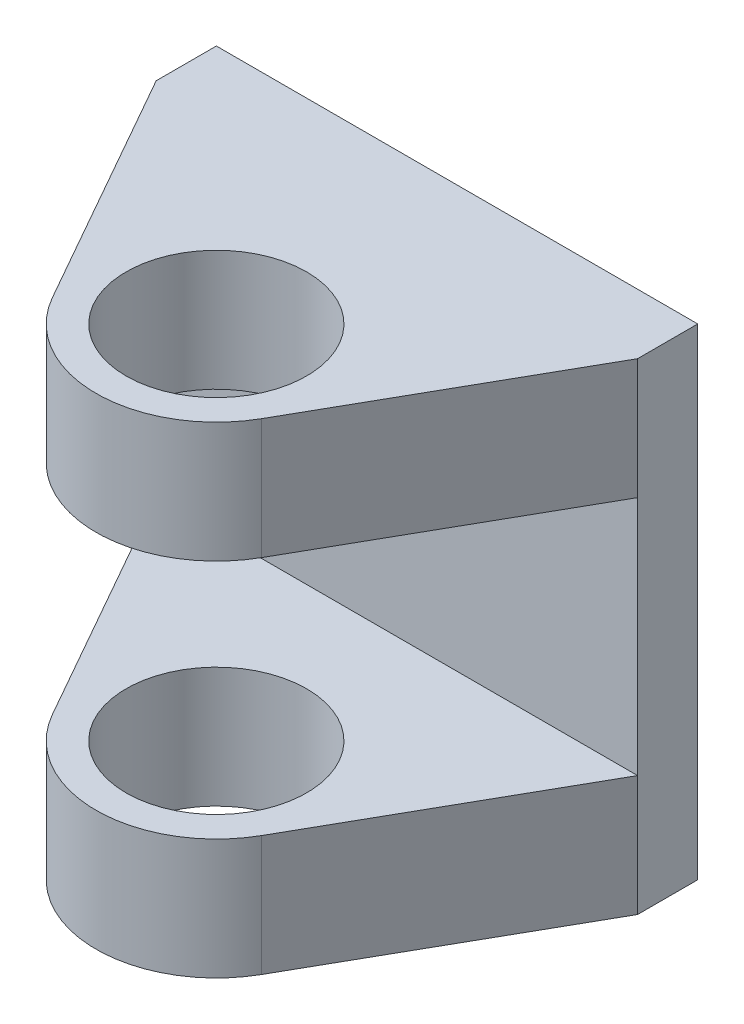
ISO-10303-21;
HEADER;
FILE_DESCRIPTION(('STEP AP214'),'2;1');
FILE_NAME('part.step','',(''),(''),'','','');
FILE_SCHEMA(('AUTOMOTIVE_DESIGN { 1 0 10303 214 1 1 1 1 }'));
ENDSEC;
DATA;
#1=APPLICATION_CONTEXT('core data for automotive mechanical design processes');
#2=APPLICATION_PROTOCOL_DEFINITION('international standard','automotive_design',2000,#1);
#3=PRODUCT_CONTEXT('',#1,'mechanical');
#4=PRODUCT('Part','Part','',(#3));
#5=PRODUCT_RELATED_PRODUCT_CATEGORY('part','',(#4));
#6=PRODUCT_DEFINITION_FORMATION('','',#4);
#7=PRODUCT_DEFINITION_CONTEXT('part definition',#1,'design');
#8=PRODUCT_DEFINITION('design','',#6,#7);
#9=PRODUCT_DEFINITION_SHAPE('','',#8);
#10=(LENGTH_UNIT() NAMED_UNIT(*) SI_UNIT(.MILLI.,.METRE.));
#11=(NAMED_UNIT(*) PLANE_ANGLE_UNIT() SI_UNIT($,.RADIAN.));
#12=(NAMED_UNIT(*) SI_UNIT($,.STERADIAN.) SOLID_ANGLE_UNIT());
#13=UNCERTAINTY_MEASURE_WITH_UNIT(LENGTH_MEASURE(1.E-05),#10,'distance_accuracy_value','');
#14=(GEOMETRIC_REPRESENTATION_CONTEXT(3) GLOBAL_UNCERTAINTY_ASSIGNED_CONTEXT((#13)) GLOBAL_UNIT_ASSIGNED_CONTEXT((#10,
#11,#12)) REPRESENTATION_CONTEXT('',''));
#15=CARTESIAN_POINT('',(0.,0.,0.));
#16=DIRECTION('',(0.,0.,1.));
#17=DIRECTION('',(1.,0.,0.));
#18=AXIS2_PLACEMENT_3D('',#15,#16,#17);
#19=CARTESIAN_POINT('',(0.,0.,10.));
#20=DIRECTION('',(0.,0.,-1.));
#21=DIRECTION('',(-1.,0.,0.));
#22=AXIS2_PLACEMENT_3D('',#19,#20,#21);
#23=PLANE('',#22);
#24=DIRECTION('',(-1.,0.,0.));
#25=VECTOR('',#24,1.);
#26=CARTESIAN_POINT('',(80.,60.,10.));
#27=LINE('',#26,#25);
#28=CARTESIAN_POINT('',(80.,60.,10.));
#29=VERTEX_POINT('',#28);
#30=CARTESIAN_POINT('',(0.,60.,10.));
#31=VERTEX_POINT('',#30);
#32=EDGE_CURVE('E69',#29,#31,#27,.T.);
#33=ORIENTED_EDGE('',*,*,#32,.T.);
#34=DIRECTION('',(0.,-1.,0.));
#35=VECTOR('',#34,1.);
#36=CARTESIAN_POINT('',(0.,0.,10.));
#37=LINE('',#36,#35);
#38=CARTESIAN_POINT('',(0.,20.,10.));
#39=VERTEX_POINT('',#38);
#40=EDGE_CURVE('E192',#31,#39,#37,.T.);
#41=ORIENTED_EDGE('',*,*,#40,.T.);
#42=DIRECTION('',(1.,0.,0.));
#43=VECTOR('',#42,1.);
#44=CARTESIAN_POINT('',(0.,20.,10.));
#45=LINE('',#44,#43);
#46=CARTESIAN_POINT('',(80.,20.,10.));
#47=VERTEX_POINT('',#46);
#48=EDGE_CURVE('E163',#39,#47,#45,.T.);
#49=ORIENTED_EDGE('',*,*,#48,.T.);
#50=DIRECTION('',(0.,1.,0.));
#51=VECTOR('',#50,1.);
#52=CARTESIAN_POINT('',(80.,0.,10.));
#53=LINE('',#52,#51);
#54=EDGE_CURVE('E191',#47,#29,#53,.T.);
#55=ORIENTED_EDGE('',*,*,#54,.T.);
#56=EDGE_LOOP('',(#33,#41,#49,#55));
#57=FACE_BOUND('',#56,.T.);
#58=ADVANCED_FACE('F46',(#57),#23,.F.);
#59=CARTESIAN_POINT('',(0.,0.,10.));
#60=DIRECTION('',(1.,0.,0.));
#61=DIRECTION('',(0.,0.,-1.));
#62=AXIS2_PLACEMENT_3D('',#59,#60,#61);
#63=PLANE('',#62);
#64=DIRECTION('',(0.,-1.,0.));
#65=VECTOR('',#64,1.);
#66=CARTESIAN_POINT('',(0.,0.,0.));
#67=LINE('',#66,#65);
#68=CARTESIAN_POINT('',(0.,80.,0.));
#69=VERTEX_POINT('',#68);
#70=CARTESIAN_POINT('',(0.,0.,0.));
#71=VERTEX_POINT('',#70);
#72=EDGE_CURVE('E186',#69,#71,#67,.T.);
#73=ORIENTED_EDGE('',*,*,#72,.T.);
#74=DIRECTION('',(0.,0.,-1.));
#75=VECTOR('',#74,1.);
#76=CARTESIAN_POINT('',(0.,0.,10.));
#77=LINE('',#76,#75);
#78=CARTESIAN_POINT('',(0.,0.,10.));
#79=VERTEX_POINT('',#78);
#80=EDGE_CURVE('E13',#79,#71,#77,.T.);
#81=ORIENTED_EDGE('',*,*,#80,.F.);
#82=DIRECTION('',(0.,-1.,0.));
#83=VECTOR('',#82,1.);
#84=CARTESIAN_POINT('',(0.,20.,10.));
#85=LINE('',#84,#83);
#86=EDGE_CURVE('E184',#39,#79,#85,.T.);
#87=ORIENTED_EDGE('',*,*,#86,.F.);
#88=ORIENTED_EDGE('',*,*,#40,.F.);
#89=CARTESIAN_POINT('',(0.,80.,10.));
#90=VERTEX_POINT('',#89);
#91=EDGE_CURVE('E147',#90,#31,#37,.T.);
#92=ORIENTED_EDGE('',*,*,#91,.F.);
#93=DIRECTION('',(0.,0.,-1.));
#94=VECTOR('',#93,1.);
#95=CARTESIAN_POINT('',(0.,80.,10.));
#96=LINE('',#95,#94);
#97=EDGE_CURVE('E196',#90,#69,#96,.T.);
#98=ORIENTED_EDGE('',*,*,#97,.T.);
#99=EDGE_LOOP('',(#73,#81,#87,#88,#92,#98));
#100=FACE_BOUND('',#99,.T.);
#101=ADVANCED_FACE('F48',(#100),#63,.F.);
#102=CARTESIAN_POINT('',(0.,0.,10.));
#103=DIRECTION('',(0.,1.,0.));
#104=DIRECTION('',(0.,0.,1.));
#105=AXIS2_PLACEMENT_3D('',#102,#103,#104);
#106=PLANE('',#105);
#107=CARTESIAN_POINT('',(40.,0.,40.));
#108=DIRECTION('',(0.,1.,0.));
#109=DIRECTION('',(0.,0.,1.));
#110=AXIS2_PLACEMENT_3D('',#107,#108,#109);
#111=CIRCLE('',#110,15.);
#112=CARTESIAN_POINT('',(40.,0.,55.));
#113=VERTEX_POINT('',#112);
#114=EDGE_CURVE('E265',#113,#113,#111,.T.);
#115=ORIENTED_EDGE('',*,*,#114,.T.);
#116=EDGE_LOOP('',(#115));
#117=FACE_BOUND('',#116,.T.);
#118=DIRECTION('',(1.,0.,0.));
#119=VECTOR('',#118,1.);
#120=CARTESIAN_POINT('',(0.,0.,0.));
#121=LINE('',#120,#119);
#122=CARTESIAN_POINT('',(80.,0.,0.));
#123=VERTEX_POINT('',#122);
#124=EDGE_CURVE('E199',#71,#123,#121,.T.);
#125=ORIENTED_EDGE('',*,*,#124,.T.);
#126=DIRECTION('',(0.,0.,-1.));
#127=VECTOR('',#126,1.);
#128=CARTESIAN_POINT('',(80.,0.,10.));
#129=LINE('',#128,#127);
#130=CARTESIAN_POINT('',(80.,0.,10.));
#131=VERTEX_POINT('',#130);
#132=EDGE_CURVE('E55',#131,#123,#129,.T.);
#133=ORIENTED_EDGE('',*,*,#132,.F.);
#134=DIRECTION('',(-0.493212111192934,0.,0.869909083394701));
#135=VECTOR('',#134,1.);
#136=CARTESIAN_POINT('',(57.398181667894,0.,49.8642422238587));
#137=LINE('',#136,#135);
#138=CARTESIAN_POINT('',(57.398181667894,0.,49.8642422238587));
#139=VERTEX_POINT('',#138);
#140=EDGE_CURVE('E161',#131,#139,#137,.T.);
#141=ORIENTED_EDGE('',*,*,#140,.T.);
#142=CARTESIAN_POINT('',(40.,0.,40.));
#143=DIRECTION('',(0.,-1.,0.));
#144=DIRECTION('',(0.,0.,-1.));
#145=AXIS2_PLACEMENT_3D('',#142,#143,#144);
#146=CIRCLE('',#145,20.);
#147=CARTESIAN_POINT('',(22.601818332106,0.,49.8642422238587));
#148=VERTEX_POINT('',#147);
#149=EDGE_CURVE('E179',#139,#148,#146,.T.);
#150=ORIENTED_EDGE('',*,*,#149,.T.);
#151=DIRECTION('',(-0.493212111192934,0.,-0.869909083394701));
#152=VECTOR('',#151,1.);
#153=CARTESIAN_POINT('',(0.,0.,10.));
#154=LINE('',#153,#152);
#155=EDGE_CURVE('E167',#148,#79,#154,.T.);
#156=ORIENTED_EDGE('',*,*,#155,.T.);
#157=ORIENTED_EDGE('',*,*,#80,.T.);
#158=EDGE_LOOP('',(#125,#133,#141,#150,#156,#157));
#159=FACE_BOUND('',#158,.T.);
#160=ADVANCED_FACE('F239',(#117,#159),#106,.F.);
#161=CARTESIAN_POINT('',(80.,0.,10.));
#162=DIRECTION('',(-1.,0.,0.));
#163=DIRECTION('',(0.,0.,1.));
#164=AXIS2_PLACEMENT_3D('',#161,#162,#163);
#165=PLANE('',#164);
#166=DIRECTION('',(0.,1.,0.));
#167=VECTOR('',#166,1.);
#168=CARTESIAN_POINT('',(80.,0.,0.));
#169=LINE('',#168,#167);
#170=CARTESIAN_POINT('',(80.,80.,0.));
#171=VERTEX_POINT('',#170);
#172=EDGE_CURVE('E201',#123,#171,#169,.T.);
#173=ORIENTED_EDGE('',*,*,#172,.T.);
#174=DIRECTION('',(0.,0.,-1.));
#175=VECTOR('',#174,1.);
#176=CARTESIAN_POINT('',(80.,80.,10.));
#177=LINE('',#176,#175);
#178=CARTESIAN_POINT('',(80.,80.,10.));
#179=VERTEX_POINT('',#178);
#180=EDGE_CURVE('E207',#179,#171,#177,.T.);
#181=ORIENTED_EDGE('',*,*,#180,.F.);
#182=DIRECTION('',(0.,1.,0.));
#183=VECTOR('',#182,1.);
#184=CARTESIAN_POINT('',(80.,60.,10.));
#185=LINE('',#184,#183);
#186=EDGE_CURVE('E62',#29,#179,#185,.T.);
#187=ORIENTED_EDGE('',*,*,#186,.F.);
#188=ORIENTED_EDGE('',*,*,#54,.F.);
#189=EDGE_CURVE('E193',#131,#47,#53,.T.);
#190=ORIENTED_EDGE('',*,*,#189,.F.);
#191=ORIENTED_EDGE('',*,*,#132,.T.);
#192=EDGE_LOOP('',(#173,#181,#187,#188,#190,#191));
#193=FACE_BOUND('',#192,.T.);
#194=ADVANCED_FACE('F214',(#193),#165,.F.);
#195=CARTESIAN_POINT('',(0.,80.,10.));
#196=DIRECTION('',(0.,-1.,0.));
#197=DIRECTION('',(0.,0.,-1.));
#198=AXIS2_PLACEMENT_3D('',#195,#196,#197);
#199=PLANE('',#198);
#200=CARTESIAN_POINT('',(40.,80.,40.));
#201=DIRECTION('',(0.,1.,0.));
#202=DIRECTION('',(0.,0.,1.));
#203=AXIS2_PLACEMENT_3D('',#200,#201,#202);
#204=CIRCLE('',#203,15.);
#205=CARTESIAN_POINT('',(40.,80.,55.));
#206=VERTEX_POINT('',#205);
#207=EDGE_CURVE('E263',#206,#206,#204,.T.);
#208=ORIENTED_EDGE('',*,*,#207,.F.);
#209=EDGE_LOOP('',(#208));
#210=FACE_BOUND('',#209,.T.);
#211=DIRECTION('',(-1.,0.,0.));
#212=VECTOR('',#211,1.);
#213=CARTESIAN_POINT('',(0.,80.,0.));
#214=LINE('',#213,#212);
#215=EDGE_CURVE('E203',#171,#69,#214,.T.);
#216=ORIENTED_EDGE('',*,*,#215,.T.);
#217=ORIENTED_EDGE('',*,*,#97,.F.);
#218=DIRECTION('',(0.493212111192934,0.,0.869909083394701));
#219=VECTOR('',#218,1.);
#220=CARTESIAN_POINT('',(22.601818332106,80.,49.8642422238587));
#221=LINE('',#220,#219);
#222=CARTESIAN_POINT('',(22.601818332106,80.,49.8642422238587));
#223=VERTEX_POINT('',#222);
#224=EDGE_CURVE('E154',#90,#223,#221,.T.);
#225=ORIENTED_EDGE('',*,*,#224,.T.);
#226=CARTESIAN_POINT('',(40.,80.,40.));
#227=DIRECTION('',(0.,1.,0.));
#228=DIRECTION('',(0.,0.,1.));
#229=AXIS2_PLACEMENT_3D('',#226,#227,#228);
#230=CIRCLE('',#229,20.);
#231=CARTESIAN_POINT('',(57.398181667894,80.,49.8642422238587));
#232=VERTEX_POINT('',#231);
#233=EDGE_CURVE('E131',#223,#232,#230,.T.);
#234=ORIENTED_EDGE('',*,*,#233,.T.);
#235=DIRECTION('',(0.493212111192934,0.,-0.869909083394701));
#236=VECTOR('',#235,1.);
#237=CARTESIAN_POINT('',(80.,80.,10.));
#238=LINE('',#237,#236);
#239=EDGE_CURVE('E149',#232,#179,#238,.T.);
#240=ORIENTED_EDGE('',*,*,#239,.T.);
#241=ORIENTED_EDGE('',*,*,#180,.T.);
#242=EDGE_LOOP('',(#216,#217,#225,#234,#240,#241));
#243=FACE_BOUND('',#242,.T.);
#244=ADVANCED_FACE('F222',(#210,#243),#199,.F.);
#245=CARTESIAN_POINT('',(0.,0.,0.));
#246=DIRECTION('',(0.,0.,-1.));
#247=DIRECTION('',(-1.,0.,0.));
#248=AXIS2_PLACEMENT_3D('',#245,#246,#247);
#249=PLANE('',#248);
#250=ORIENTED_EDGE('',*,*,#72,.F.);
#251=ORIENTED_EDGE('',*,*,#215,.F.);
#252=ORIENTED_EDGE('',*,*,#172,.F.);
#253=ORIENTED_EDGE('',*,*,#124,.F.);
#254=EDGE_LOOP('',(#250,#251,#252,#253));
#255=FACE_BOUND('',#254,.T.);
#256=ADVANCED_FACE('F219',(#255),#249,.T.);
#257=CARTESIAN_POINT('',(0.,20.,10.));
#258=DIRECTION('',(-0.869909083394701,0.,0.493212111192934));
#259=DIRECTION('',(0.493212111192934,0.,0.869909083394701));
#260=AXIS2_PLACEMENT_3D('',#257,#258,#259);
#261=PLANE('',#260);
#262=ORIENTED_EDGE('',*,*,#155,.F.);
#263=DIRECTION('',(0.,-1.,0.));
#264=VECTOR('',#263,1.);
#265=CARTESIAN_POINT('',(22.601818332106,20.,49.8642422238587));
#266=LINE('',#265,#264);
#267=CARTESIAN_POINT('',(22.601818332106,20.,49.8642422238587));
#268=VERTEX_POINT('',#267);
#269=EDGE_CURVE('E187',#268,#148,#266,.T.);
#270=ORIENTED_EDGE('',*,*,#269,.F.);
#271=DIRECTION('',(-0.493212111192934,0.,-0.869909083394701));
#272=VECTOR('',#271,1.);
#273=CARTESIAN_POINT('',(0.,20.,10.));
#274=LINE('',#273,#272);
#275=EDGE_CURVE('E173',#268,#39,#274,.T.);
#276=ORIENTED_EDGE('',*,*,#275,.T.);
#277=ORIENTED_EDGE('',*,*,#86,.T.);
#278=EDGE_LOOP('',(#262,#270,#276,#277));
#279=FACE_BOUND('',#278,.T.);
#280=ADVANCED_FACE('F233',(#279),#261,.T.);
#281=CARTESIAN_POINT('',(40.,20.,40.));
#282=DIRECTION('',(0.,-1.,0.));
#283=DIRECTION('',(0.,0.,-1.));
#284=AXIS2_PLACEMENT_3D('',#281,#282,#283);
#285=CYLINDRICAL_SURFACE('',#284,20.);
#286=ORIENTED_EDGE('',*,*,#149,.F.);
#287=DIRECTION('',(0.,-1.,0.));
#288=VECTOR('',#287,1.);
#289=CARTESIAN_POINT('',(57.398181667894,20.,49.8642422238587));
#290=LINE('',#289,#288);
#291=CARTESIAN_POINT('',(57.398181667894,20.,49.8642422238587));
#292=VERTEX_POINT('',#291);
#293=EDGE_CURVE('E176',#292,#139,#290,.T.);
#294=ORIENTED_EDGE('',*,*,#293,.F.);
#295=CARTESIAN_POINT('',(40.,20.,40.));
#296=DIRECTION('',(0.,-1.,0.));
#297=DIRECTION('',(0.,0.,-1.));
#298=AXIS2_PLACEMENT_3D('',#295,#296,#297);
#299=CIRCLE('',#298,20.);
#300=EDGE_CURVE('E170',#292,#268,#299,.T.);
#301=ORIENTED_EDGE('',*,*,#300,.T.);
#302=ORIENTED_EDGE('',*,*,#269,.T.);
#303=EDGE_LOOP('',(#286,#294,#301,#302));
#304=FACE_BOUND('',#303,.T.);
#305=ADVANCED_FACE('F236',(#304),#285,.T.);
#306=CARTESIAN_POINT('',(57.398181667894,20.,49.8642422238587));
#307=DIRECTION('',(0.869909083394701,0.,0.493212111192934));
#308=DIRECTION('',(0.493212111192935,0.,-0.869909083394701));
#309=AXIS2_PLACEMENT_3D('',#306,#307,#308);
#310=PLANE('',#309);
#311=ORIENTED_EDGE('',*,*,#140,.F.);
#312=ORIENTED_EDGE('',*,*,#189,.T.);
#313=DIRECTION('',(-0.493212111192934,0.,0.869909083394701));
#314=VECTOR('',#313,1.);
#315=CARTESIAN_POINT('',(57.398181667894,20.,49.8642422238587));
#316=LINE('',#315,#314);
#317=EDGE_CURVE('E166',#47,#292,#316,.T.);
#318=ORIENTED_EDGE('',*,*,#317,.T.);
#319=ORIENTED_EDGE('',*,*,#293,.T.);
#320=EDGE_LOOP('',(#311,#312,#318,#319));
#321=FACE_BOUND('',#320,.T.);
#322=ADVANCED_FACE('F238',(#321),#310,.T.);
#323=CARTESIAN_POINT('',(40.,20.,40.));
#324=DIRECTION('',(0.,-1.,0.));
#325=DIRECTION('',(0.,0.,-1.));
#326=AXIS2_PLACEMENT_3D('',#323,#324,#325);
#327=PLANE('',#326);
#328=CARTESIAN_POINT('',(40.,20.,40.));
#329=DIRECTION('',(0.,-1.,0.));
#330=DIRECTION('',(0.,0.,-1.));
#331=AXIS2_PLACEMENT_3D('',#328,#329,#330);
#332=CIRCLE('',#331,15.);
#333=CARTESIAN_POINT('',(40.,20.,55.));
#334=VERTEX_POINT('',#333);
#335=EDGE_CURVE('E156',#334,#334,#332,.T.);
#336=ORIENTED_EDGE('',*,*,#335,.T.);
#337=EDGE_LOOP('',(#336));
#338=FACE_BOUND('',#337,.T.);
#339=ORIENTED_EDGE('',*,*,#48,.F.);
#340=ORIENTED_EDGE('',*,*,#275,.F.);
#341=ORIENTED_EDGE('',*,*,#300,.F.);
#342=ORIENTED_EDGE('',*,*,#317,.F.);
#343=EDGE_LOOP('',(#339,#340,#341,#342));
#344=FACE_BOUND('',#343,.T.);
#345=ADVANCED_FACE('F229',(#338,#344),#327,.F.);
#346=CARTESIAN_POINT('',(80.,60.,10.));
#347=DIRECTION('',(0.869909083394701,0.,0.493212111192934));
#348=DIRECTION('',(0.493212111192935,0.,-0.869909083394701));
#349=AXIS2_PLACEMENT_3D('',#346,#347,#348);
#350=PLANE('',#349);
#351=ORIENTED_EDGE('',*,*,#239,.F.);
#352=DIRECTION('',(0.,1.,0.));
#353=VECTOR('',#352,1.);
#354=CARTESIAN_POINT('',(57.398181667894,60.,49.8642422238587));
#355=LINE('',#354,#353);
#356=CARTESIAN_POINT('',(57.398181667894,60.,49.8642422238587));
#357=VERTEX_POINT('',#356);
#358=EDGE_CURVE('E136',#357,#232,#355,.T.);
#359=ORIENTED_EDGE('',*,*,#358,.F.);
#360=DIRECTION('',(0.493212111192934,0.,-0.869909083394701));
#361=VECTOR('',#360,1.);
#362=CARTESIAN_POINT('',(80.,60.,10.));
#363=LINE('',#362,#361);
#364=EDGE_CURVE('E137',#357,#29,#363,.T.);
#365=ORIENTED_EDGE('',*,*,#364,.T.);
#366=ORIENTED_EDGE('',*,*,#186,.T.);
#367=EDGE_LOOP('',(#351,#359,#365,#366));
#368=FACE_BOUND('',#367,.T.);
#369=ADVANCED_FACE('F286',(#368),#350,.T.);
#370=CARTESIAN_POINT('',(40.,60.,40.));
#371=DIRECTION('',(0.,1.,0.));
#372=DIRECTION('',(0.,0.,1.));
#373=AXIS2_PLACEMENT_3D('',#370,#371,#372);
#374=CYLINDRICAL_SURFACE('',#373,20.);
#375=ORIENTED_EDGE('',*,*,#233,.F.);
#376=DIRECTION('',(0.,1.,0.));
#377=VECTOR('',#376,1.);
#378=CARTESIAN_POINT('',(22.601818332106,60.,49.8642422238587));
#379=LINE('',#378,#377);
#380=CARTESIAN_POINT('',(22.601818332106,60.,49.8642422238587));
#381=VERTEX_POINT('',#380);
#382=EDGE_CURVE('E125',#381,#223,#379,.T.);
#383=ORIENTED_EDGE('',*,*,#382,.F.);
#384=CARTESIAN_POINT('',(40.,60.,40.));
#385=DIRECTION('',(0.,1.,0.));
#386=DIRECTION('',(0.,0.,1.));
#387=AXIS2_PLACEMENT_3D('',#384,#385,#386);
#388=CIRCLE('',#387,20.);
#389=EDGE_CURVE('E128',#381,#357,#388,.T.);
#390=ORIENTED_EDGE('',*,*,#389,.T.);
#391=ORIENTED_EDGE('',*,*,#358,.T.);
#392=EDGE_LOOP('',(#375,#383,#390,#391));
#393=FACE_BOUND('',#392,.T.);
#394=ADVANCED_FACE('F127',(#393),#374,.T.);
#395=CARTESIAN_POINT('',(22.601818332106,60.,49.8642422238587));
#396=DIRECTION('',(-0.869909083394701,0.,0.493212111192934));
#397=DIRECTION('',(0.493212111192934,0.,0.869909083394701));
#398=AXIS2_PLACEMENT_3D('',#395,#396,#397);
#399=PLANE('',#398);
#400=ORIENTED_EDGE('',*,*,#224,.F.);
#401=ORIENTED_EDGE('',*,*,#91,.T.);
#402=DIRECTION('',(0.493212111192934,0.,0.869909083394701));
#403=VECTOR('',#402,1.);
#404=CARTESIAN_POINT('',(22.601818332106,60.,49.8642422238587));
#405=LINE('',#404,#403);
#406=EDGE_CURVE('E142',#31,#381,#405,.T.);
#407=ORIENTED_EDGE('',*,*,#406,.T.);
#408=ORIENTED_EDGE('',*,*,#382,.T.);
#409=EDGE_LOOP('',(#400,#401,#407,#408));
#410=FACE_BOUND('',#409,.T.);
#411=ADVANCED_FACE('F146',(#410),#399,.T.);
#412=CARTESIAN_POINT('',(40.,60.,40.));
#413=DIRECTION('',(0.,1.,0.));
#414=DIRECTION('',(0.,0.,1.));
#415=AXIS2_PLACEMENT_3D('',#412,#413,#414);
#416=PLANE('',#415);
#417=CARTESIAN_POINT('',(40.,60.,40.));
#418=DIRECTION('',(0.,1.,0.));
#419=DIRECTION('',(0.,0.,1.));
#420=AXIS2_PLACEMENT_3D('',#417,#418,#419);
#421=CIRCLE('',#420,15.);
#422=CARTESIAN_POINT('',(40.,60.,55.));
#423=VERTEX_POINT('',#422);
#424=EDGE_CURVE('E50',#423,#423,#421,.T.);
#425=ORIENTED_EDGE('',*,*,#424,.T.);
#426=EDGE_LOOP('',(#425));
#427=FACE_BOUND('',#426,.T.);
#428=ORIENTED_EDGE('',*,*,#32,.F.);
#429=ORIENTED_EDGE('',*,*,#364,.F.);
#430=ORIENTED_EDGE('',*,*,#389,.F.);
#431=ORIENTED_EDGE('',*,*,#406,.F.);
#432=EDGE_LOOP('',(#428,#429,#430,#431));
#433=FACE_BOUND('',#432,.T.);
#434=ADVANCED_FACE('F141',(#427,#433),#416,.F.);
#435=CARTESIAN_POINT('',(40.,0.,40.));
#436=DIRECTION('',(0.,1.,0.));
#437=DIRECTION('',(0.,0.,1.));
#438=AXIS2_PLACEMENT_3D('',#435,#436,#437);
#439=CYLINDRICAL_SURFACE('',#438,15.);
#440=CARTESIAN_POINT('',(40.,80.,55.));
#441=CARTESIAN_POINT('',(40.,79.7916666666667,55.));
#442=CARTESIAN_POINT('',(40.,79.5833333333333,55.));
#443=CARTESIAN_POINT('',(40.,79.1666666666667,55.));
#444=CARTESIAN_POINT('',(40.,78.9583333333333,55.));
#445=CARTESIAN_POINT('',(40.,78.5416666666667,55.));
#446=CARTESIAN_POINT('',(40.,78.3333333333333,55.));
#447=CARTESIAN_POINT('',(40.,77.9166666666667,55.));
#448=CARTESIAN_POINT('',(40.,77.7083333333333,55.));
#449=CARTESIAN_POINT('',(40.,77.2916666666667,55.));
#450=CARTESIAN_POINT('',(40.,77.0833333333333,55.));
#451=CARTESIAN_POINT('',(40.,76.6666666666667,55.));
#452=CARTESIAN_POINT('',(40.,76.4583333333333,55.));
#453=CARTESIAN_POINT('',(40.,76.0416666666667,55.));
#454=CARTESIAN_POINT('',(40.,75.8333333333333,55.));
#455=CARTESIAN_POINT('',(40.,75.4166666666667,55.));
#456=CARTESIAN_POINT('',(40.,75.2083333333333,55.));
#457=CARTESIAN_POINT('',(40.,74.7916666666667,55.));
#458=CARTESIAN_POINT('',(40.,74.5833333333333,55.));
#459=CARTESIAN_POINT('',(40.,74.1666666666667,55.));
#460=CARTESIAN_POINT('',(40.,73.9583333333333,55.));
#461=CARTESIAN_POINT('',(40.,73.5416666666667,55.));
#462=CARTESIAN_POINT('',(40.,73.3333333333333,55.));
#463=CARTESIAN_POINT('',(40.,72.9166666666667,55.));
#464=CARTESIAN_POINT('',(40.,72.7083333333333,55.));
#465=CARTESIAN_POINT('',(40.,72.2916666666667,55.));
#466=CARTESIAN_POINT('',(40.,72.0833333333333,55.));
#467=CARTESIAN_POINT('',(40.,71.6666666666667,55.));
#468=CARTESIAN_POINT('',(40.,71.4583333333333,55.));
#469=CARTESIAN_POINT('',(40.,71.0416666666667,55.));
#470=CARTESIAN_POINT('',(40.,70.8333333333333,55.));
#471=CARTESIAN_POINT('',(40.,70.4166666666667,55.));
#472=CARTESIAN_POINT('',(40.,70.2083333333333,55.));
#473=CARTESIAN_POINT('',(40.,69.7916666666667,55.));
#474=CARTESIAN_POINT('',(40.,69.5833333333333,55.));
#475=CARTESIAN_POINT('',(40.,69.1666666666667,55.));
#476=CARTESIAN_POINT('',(40.,68.9583333333333,55.));
#477=CARTESIAN_POINT('',(40.,68.5416666666667,55.));
#478=CARTESIAN_POINT('',(40.,68.3333333333333,55.));
#479=CARTESIAN_POINT('',(40.,67.9166666666667,55.));
#480=CARTESIAN_POINT('',(40.,67.7083333333333,55.));
#481=CARTESIAN_POINT('',(40.,67.2916666666667,55.));
#482=CARTESIAN_POINT('',(40.,67.0833333333333,55.));
#483=CARTESIAN_POINT('',(40.,66.6666666666667,55.));
#484=CARTESIAN_POINT('',(40.,66.4583333333333,55.));
#485=CARTESIAN_POINT('',(40.,66.0416666666667,55.));
#486=CARTESIAN_POINT('',(40.,65.8333333333333,55.));
#487=CARTESIAN_POINT('',(40.,65.4166666666667,55.));
#488=CARTESIAN_POINT('',(40.,65.2083333333333,55.));
#489=CARTESIAN_POINT('',(40.,64.7916666666667,55.));
#490=CARTESIAN_POINT('',(40.,64.5833333333333,55.));
#491=CARTESIAN_POINT('',(40.,64.1666666666666,55.));
#492=CARTESIAN_POINT('',(40.,63.9583333333333,55.));
#493=CARTESIAN_POINT('',(40.,63.5416666666667,55.));
#494=CARTESIAN_POINT('',(40.,63.3333333333333,55.));
#495=CARTESIAN_POINT('',(40.,62.9166666666667,55.));
#496=CARTESIAN_POINT('',(40.,62.7083333333333,55.));
#497=CARTESIAN_POINT('',(40.,62.2916666666667,55.));
#498=CARTESIAN_POINT('',(40.,62.0833333333333,55.));
#499=CARTESIAN_POINT('',(40.,61.6666666666667,55.));
#500=CARTESIAN_POINT('',(40.,61.4583333333333,55.));
#501=CARTESIAN_POINT('',(40.,61.0416666666667,55.));
#502=CARTESIAN_POINT('',(40.,60.8333333333333,55.));
#503=CARTESIAN_POINT('',(40.,60.4166666666667,55.));
#504=CARTESIAN_POINT('',(40.,60.2083333333333,55.));
#505=CARTESIAN_POINT('',(40.,60.,55.));
#506=B_SPLINE_CURVE_WITH_KNOTS('',3,(#440,#441,#442,#443,#444,#445,#446,#447,#448,#449,#450,
#451,#452,#453,#454,#455,#456,#457,#458,#459,#460,#461,#462,#463,#464,#465,#466,#467,#468,#469,
#470,#471,#472,#473,#474,#475,#476,#477,#478,#479,#480,#481,#482,#483,#484,#485,#486,#487,#488,
#489,#490,#491,#492,#493,#494,#495,#496,#497,#498,#499,#500,#501,#502,#503,#504,#505),
.UNSPECIFIED.,.F.,.F.,(4,2,2,2,2,2,2,2,2,2,2,2,2,2,2,2,2,2,2,2,2,2,2,2,2,2,2,2,2,2,2,2,4),(0.,
0.625000000000001,1.25,1.875,2.5,3.125,3.75,4.375,5.,5.62500000000001,6.25000000000001,
6.87500000000001,7.50000000000001,8.12500000000001,8.75000000000001,9.37500000000001,10.,10.625,
11.25,11.875,12.5,13.125,13.75,14.375,15.,15.625,16.25,16.875,17.5,18.125,18.75,19.375,20.),.UNSPECIFIED.);
#507=EDGE_CURVE('BSEAM275',#206,#423,#506,.T.);
#508=ORIENTED_EDGE('',*,*,#207,.T.);
#509=ORIENTED_EDGE('',*,*,#424,.F.);
#510=ORIENTED_EDGE('',*,*,#507,.T.);
#511=ORIENTED_EDGE('',*,*,#507,.F.);
#512=EDGE_LOOP('',(#508,#510,#509,#511));
#513=FACE_BOUND('',#512,.T.);
#514=ADVANCED_FACE('F275',(#513),#439,.F.);
#515=CARTESIAN_POINT('',(40.,0.,55.));
#516=CARTESIAN_POINT('',(40.,0.208333333333306,55.));
#517=CARTESIAN_POINT('',(40.,0.41666666666664,55.));
#518=CARTESIAN_POINT('',(40.,0.833333333333307,55.));
#519=CARTESIAN_POINT('',(40.,1.04166666666664,55.));
#520=CARTESIAN_POINT('',(40.,1.45833333333331,55.));
#521=CARTESIAN_POINT('',(40.,1.66666666666664,55.));
#522=CARTESIAN_POINT('',(40.,2.08333333333331,55.));
#523=CARTESIAN_POINT('',(40.,2.29166666666664,55.));
#524=CARTESIAN_POINT('',(40.,2.70833333333331,55.));
#525=CARTESIAN_POINT('',(40.,2.91666666666664,55.));
#526=CARTESIAN_POINT('',(40.,3.33333333333331,55.));
#527=CARTESIAN_POINT('',(40.,3.54166666666665,55.));
#528=CARTESIAN_POINT('',(40.,3.95833333333331,55.));
#529=CARTESIAN_POINT('',(40.,4.16666666666665,55.));
#530=CARTESIAN_POINT('',(40.,4.58333333333331,55.));
#531=CARTESIAN_POINT('',(40.,4.79166666666665,55.));
#532=CARTESIAN_POINT('',(40.,5.20833333333331,55.));
#533=CARTESIAN_POINT('',(40.,5.41666666666665,55.));
#534=CARTESIAN_POINT('',(40.,5.83333333333332,55.));
#535=CARTESIAN_POINT('',(40.,6.04166666666665,55.));
#536=CARTESIAN_POINT('',(40.,6.45833333333332,55.));
#537=CARTESIAN_POINT('',(40.,6.66666666666665,55.));
#538=CARTESIAN_POINT('',(40.,7.08333333333332,55.));
#539=CARTESIAN_POINT('',(40.,7.29166666666665,55.));
#540=CARTESIAN_POINT('',(40.,7.70833333333332,55.));
#541=CARTESIAN_POINT('',(40.,7.91666666666665,55.));
#542=CARTESIAN_POINT('',(40.,8.33333333333332,55.));
#543=CARTESIAN_POINT('',(40.,8.54166666666665,55.));
#544=CARTESIAN_POINT('',(40.,8.95833333333332,55.));
#545=CARTESIAN_POINT('',(40.,9.16666666666666,55.));
#546=CARTESIAN_POINT('',(40.,9.58333333333332,55.));
#547=CARTESIAN_POINT('',(40.,9.79166666666666,55.));
#548=CARTESIAN_POINT('',(40.,10.2083333333333,55.));
#549=CARTESIAN_POINT('',(40.,10.4166666666667,55.));
#550=CARTESIAN_POINT('',(40.,10.8333333333333,55.));
#551=CARTESIAN_POINT('',(40.,11.0416666666667,55.));
#552=CARTESIAN_POINT('',(40.,11.4583333333333,55.));
#553=CARTESIAN_POINT('',(40.,11.6666666666667,55.));
#554=CARTESIAN_POINT('',(40.,12.0833333333333,55.));
#555=CARTESIAN_POINT('',(40.,12.2916666666667,55.));
#556=CARTESIAN_POINT('',(40.,12.7083333333333,55.));
#557=CARTESIAN_POINT('',(40.,12.9166666666667,55.));
#558=CARTESIAN_POINT('',(40.,13.3333333333333,55.));
#559=CARTESIAN_POINT('',(40.,13.5416666666667,55.));
#560=CARTESIAN_POINT('',(40.,13.9583333333333,55.));
#561=CARTESIAN_POINT('',(40.,14.1666666666667,55.));
#562=CARTESIAN_POINT('',(40.,14.5833333333333,55.));
#563=CARTESIAN_POINT('',(40.,14.7916666666667,55.));
#564=CARTESIAN_POINT('',(40.,15.2083333333333,55.));
#565=CARTESIAN_POINT('',(40.,15.4166666666667,55.));
#566=CARTESIAN_POINT('',(40.,15.8333333333333,55.));
#567=CARTESIAN_POINT('',(40.,16.0416666666667,55.));
#568=CARTESIAN_POINT('',(40.,16.4583333333333,55.));
#569=CARTESIAN_POINT('',(40.,16.6666666666667,55.));
#570=CARTESIAN_POINT('',(40.,17.0833333333333,55.));
#571=CARTESIAN_POINT('',(40.,17.2916666666667,55.));
#572=CARTESIAN_POINT('',(40.,17.7083333333333,55.));
#573=CARTESIAN_POINT('',(40.,17.9166666666667,55.));
#574=CARTESIAN_POINT('',(40.,18.3333333333333,55.));
#575=CARTESIAN_POINT('',(40.,18.5416666666667,55.));
#576=CARTESIAN_POINT('',(40.,18.9583333333333,55.));
#577=CARTESIAN_POINT('',(40.,19.1666666666667,55.));
#578=CARTESIAN_POINT('',(40.,19.5833333333333,55.));
#579=CARTESIAN_POINT('',(40.,19.7916666666667,55.));
#580=CARTESIAN_POINT('',(40.,20.,55.));
#581=B_SPLINE_CURVE_WITH_KNOTS('',3,(#515,#516,#517,#518,#519,#520,#521,#522,#523,#524,#525,
#526,#527,#528,#529,#530,#531,#532,#533,#534,#535,#536,#537,#538,#539,#540,#541,#542,#543,#544,
#545,#546,#547,#548,#549,#550,#551,#552,#553,#554,#555,#556,#557,#558,#559,#560,#561,#562,#563,
#564,#565,#566,#567,#568,#569,#570,#571,#572,#573,#574,#575,#576,#577,#578,#579,#580),
.UNSPECIFIED.,.F.,.F.,(4,2,2,2,2,2,2,2,2,2,2,2,2,2,2,2,2,2,2,2,2,2,2,2,2,2,2,2,2,2,2,2,4),(0.,
0.625000000000001,1.25,1.875,2.5,3.12500000000001,3.75000000000001,4.37500000000001,
5.00000000000001,5.62500000000001,6.25000000000001,6.87500000000001,7.50000000000001,
8.12500000000001,8.75000000000001,9.37500000000002,10.,10.625,11.25,11.875,12.5,13.125,13.75,
14.375,15.,15.625,16.25,16.875,17.5,18.125,18.75,19.375,20.),.UNSPECIFIED.);
#582=EDGE_CURVE('BSEAM277',#113,#334,#581,.T.);
#583=ORIENTED_EDGE('',*,*,#114,.F.);
#584=ORIENTED_EDGE('',*,*,#335,.F.);
#585=ORIENTED_EDGE('',*,*,#582,.T.);
#586=ORIENTED_EDGE('',*,*,#582,.F.);
#587=EDGE_LOOP('',(#583,#585,#584,#586));
#588=FACE_BOUND('',#587,.T.);
#589=ADVANCED_FACE('F277',(#588),#439,.F.);
#590=CLOSED_SHELL('',(#58,#101,#160,#194,#244,#256,#280,#305,#322,#345,#369,#394,#411,#434,#514,#589));
#591=MANIFOLD_SOLID_BREP('B2',#590);
#592=ADVANCED_BREP_SHAPE_REPRESENTATION('',(#18,#591),#14);
#593=SHAPE_DEFINITION_REPRESENTATION(#9,#592);
ENDSEC;
END-ISO-10303-21;
